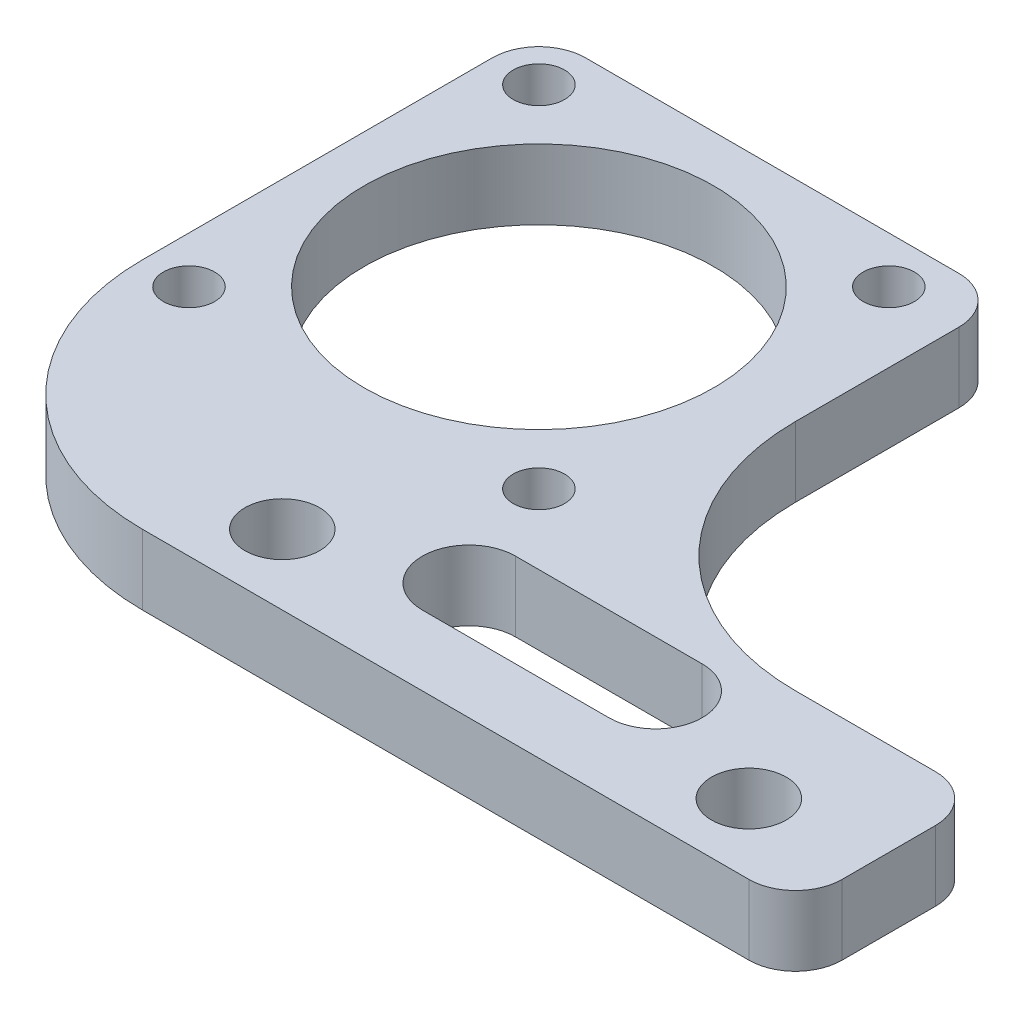
ISO-10303-21;
HEADER;
FILE_DESCRIPTION(('STEP AP214'),'2;1');
FILE_NAME('part.step','',(''),(''),'','','');
FILE_SCHEMA(('AUTOMOTIVE_DESIGN { 1 0 10303 214 1 1 1 1 }'));
ENDSEC;
DATA;
#1=APPLICATION_CONTEXT('core data for automotive mechanical design processes');
#2=APPLICATION_PROTOCOL_DEFINITION('international standard','automotive_design',2000,#1);
#3=PRODUCT_CONTEXT('',#1,'mechanical');
#4=PRODUCT('Part','Part','',(#3));
#5=PRODUCT_RELATED_PRODUCT_CATEGORY('part','',(#4));
#6=PRODUCT_DEFINITION_FORMATION('','',#4);
#7=PRODUCT_DEFINITION_CONTEXT('part definition',#1,'design');
#8=PRODUCT_DEFINITION('design','',#6,#7);
#9=PRODUCT_DEFINITION_SHAPE('','',#8);
#10=(LENGTH_UNIT() NAMED_UNIT(*) SI_UNIT(.MILLI.,.METRE.));
#11=(NAMED_UNIT(*) PLANE_ANGLE_UNIT() SI_UNIT($,.RADIAN.));
#12=(NAMED_UNIT(*) SI_UNIT($,.STERADIAN.) SOLID_ANGLE_UNIT());
#13=UNCERTAINTY_MEASURE_WITH_UNIT(LENGTH_MEASURE(1.E-05),#10,'distance_accuracy_value','');
#14=(GEOMETRIC_REPRESENTATION_CONTEXT(3) GLOBAL_UNCERTAINTY_ASSIGNED_CONTEXT((#13)) GLOBAL_UNIT_ASSIGNED_CONTEXT((#10,
#11,#12)) REPRESENTATION_CONTEXT('',''));
#15=CARTESIAN_POINT('',(0.,0.,0.));
#16=DIRECTION('',(0.,0.,1.));
#17=DIRECTION('',(1.,0.,0.));
#18=AXIS2_PLACEMENT_3D('',#15,#16,#17);
#19=CARTESIAN_POINT('',(0.,3.,0.));
#20=DIRECTION('',(0.,1.,0.));
#21=DIRECTION('',(0.,0.,1.));
#22=AXIS2_PLACEMENT_3D('',#19,#20,#21);
#23=PLANE('',#22);
#24=CARTESIAN_POINT('',(9.5,3.,12.5));
#25=DIRECTION('',(0.,1.,0.));
#26=DIRECTION('',(0.,0.,1.));
#27=AXIS2_PLACEMENT_3D('',#24,#25,#26);
#28=CIRCLE('',#27,2.);
#29=CARTESIAN_POINT('',(9.5,3.,10.5));
#30=VERTEX_POINT('',#29);
#31=CARTESIAN_POINT('',(9.5,3.,14.5));
#32=VERTEX_POINT('',#31);
#33=EDGE_CURVE('E183',#30,#32,#28,.T.);
#34=ORIENTED_EDGE('',*,*,#33,.F.);
#35=DIRECTION('',(-1.,0.,0.));
#36=VECTOR('',#35,1.);
#37=CARTESIAN_POINT('',(9.5,3.,10.5));
#38=LINE('',#37,#36);
#39=CARTESIAN_POINT('',(17.5,3.,10.5));
#40=VERTEX_POINT('',#39);
#41=EDGE_CURVE('E187',#40,#30,#38,.T.);
#42=ORIENTED_EDGE('',*,*,#41,.F.);
#43=CARTESIAN_POINT('',(17.5,3.,12.5));
#44=DIRECTION('',(0.,1.,0.));
#45=DIRECTION('',(0.,0.,1.));
#46=AXIS2_PLACEMENT_3D('',#43,#44,#45);
#47=CIRCLE('',#46,2.);
#48=CARTESIAN_POINT('',(17.5,3.,14.5));
#49=VERTEX_POINT('',#48);
#50=EDGE_CURVE('E165',#49,#40,#47,.T.);
#51=ORIENTED_EDGE('',*,*,#50,.F.);
#52=DIRECTION('',(1.,0.,0.));
#53=VECTOR('',#52,1.);
#54=CARTESIAN_POINT('',(9.5,3.,14.5));
#55=LINE('',#54,#53);
#56=EDGE_CURVE('E177',#32,#49,#55,.T.);
#57=ORIENTED_EDGE('',*,*,#56,.F.);
#58=EDGE_LOOP('',(#34,#42,#51,#57));
#59=FACE_BOUND('',#58,.T.);
#60=CARTESIAN_POINT('',(0.,3.,0.));
#61=DIRECTION('',(0.,1.,0.));
#62=DIRECTION('',(0.,0.,1.));
#63=AXIS2_PLACEMENT_3D('',#60,#61,#62);
#64=CIRCLE('',#63,7.5);
#65=CARTESIAN_POINT('',(0.,3.,7.5));
#66=VERTEX_POINT('',#65);
#67=EDGE_CURVE('E208',#66,#66,#64,.T.);
#68=ORIENTED_EDGE('',*,*,#67,.F.);
#69=EDGE_LOOP('',(#68));
#70=FACE_BOUND('',#69,.T.);
#71=DIRECTION('',(-1.,0.,0.));
#72=VECTOR('',#71,1.);
#73=CARTESIAN_POINT('',(-9.5,3.,-9.5));
#74=LINE('',#73,#72);
#75=CARTESIAN_POINT('',(8.49999999999999,3.,-9.5));
#76=VERTEX_POINT('',#75);
#77=CARTESIAN_POINT('',(-7.5,3.,-9.5));
#78=VERTEX_POINT('',#77);
#79=EDGE_CURVE('E334',#76,#78,#74,.T.);
#80=ORIENTED_EDGE('',*,*,#79,.T.);
#81=CARTESIAN_POINT('',(-7.5,3.,-7.5));
#82=DIRECTION('',(0.,1.,0.));
#83=DIRECTION('',(0.,0.,1.));
#84=AXIS2_PLACEMENT_3D('',#81,#82,#83);
#85=CIRCLE('',#84,2.);
#86=CARTESIAN_POINT('',(-9.5,3.,-7.5));
#87=VERTEX_POINT('',#86);
#88=EDGE_CURVE('E236',#78,#87,#85,.T.);
#89=ORIENTED_EDGE('',*,*,#88,.T.);
#90=DIRECTION('',(0.,0.,1.));
#91=VECTOR('',#90,1.);
#92=CARTESIAN_POINT('',(-9.5,3.,-9.5));
#93=LINE('',#92,#91);
#94=CARTESIAN_POINT('',(-9.5,3.,7.5));
#95=VERTEX_POINT('',#94);
#96=EDGE_CURVE('E248',#87,#95,#93,.T.);
#97=ORIENTED_EDGE('',*,*,#96,.T.);
#98=CARTESIAN_POINT('',(0.500000000000002,3.,7.5));
#99=DIRECTION('',(0.,1.,0.));
#100=DIRECTION('',(0.,0.,1.));
#101=AXIS2_PLACEMENT_3D('',#98,#99,#100);
#102=CIRCLE('',#101,10.);
#103=CARTESIAN_POINT('',(0.500000000000002,3.,17.5));
#104=VERTEX_POINT('',#103);
#105=EDGE_CURVE('E318',#95,#104,#102,.T.);
#106=ORIENTED_EDGE('',*,*,#105,.T.);
#107=DIRECTION('',(1.,0.,0.));
#108=VECTOR('',#107,1.);
#109=CARTESIAN_POINT('',(-9.5,3.,17.5));
#110=LINE('',#109,#108);
#111=CARTESIAN_POINT('',(26.5,3.,17.5));
#112=VERTEX_POINT('',#111);
#113=EDGE_CURVE('E253',#104,#112,#110,.T.);
#114=ORIENTED_EDGE('',*,*,#113,.T.);
#115=CARTESIAN_POINT('',(26.5,3.,15.5));
#116=DIRECTION('',(0.,1.,0.));
#117=DIRECTION('',(0.,0.,1.));
#118=AXIS2_PLACEMENT_3D('',#115,#116,#117);
#119=CIRCLE('',#118,2.);
#120=CARTESIAN_POINT('',(28.5,3.,15.5));
#121=VERTEX_POINT('',#120);
#122=EDGE_CURVE('E265',#112,#121,#119,.T.);
#123=ORIENTED_EDGE('',*,*,#122,.T.);
#124=DIRECTION('',(0.,0.,-1.));
#125=VECTOR('',#124,1.);
#126=CARTESIAN_POINT('',(28.5,3.,-9.5));
#127=LINE('',#126,#125);
#128=CARTESIAN_POINT('',(28.5,3.,11.5));
#129=VERTEX_POINT('',#128);
#130=EDGE_CURVE('E261',#121,#129,#127,.T.);
#131=ORIENTED_EDGE('',*,*,#130,.T.);
#132=CARTESIAN_POINT('',(26.5,3.,11.5));
#133=DIRECTION('',(0.,1.,0.));
#134=DIRECTION('',(0.,0.,1.));
#135=AXIS2_PLACEMENT_3D('',#132,#133,#134);
#136=CIRCLE('',#135,2.);
#137=CARTESIAN_POINT('',(26.5,3.,9.5));
#138=VERTEX_POINT('',#137);
#139=EDGE_CURVE('E69',#129,#138,#136,.T.);
#140=ORIENTED_EDGE('',*,*,#139,.T.);
#141=DIRECTION('',(1.,0.,0.));
#142=VECTOR('',#141,1.);
#143=CARTESIAN_POINT('',(10.5,3.,9.5));
#144=LINE('',#143,#142);
#145=CARTESIAN_POINT('',(20.5,3.,9.5));
#146=VERTEX_POINT('',#145);
#147=EDGE_CURVE('E215',#146,#138,#144,.T.);
#148=ORIENTED_EDGE('',*,*,#147,.F.);
#149=CARTESIAN_POINT('',(20.5,3.,-0.499999999999999));
#150=DIRECTION('',(0.,1.,0.));
#151=DIRECTION('',(0.,0.,1.));
#152=AXIS2_PLACEMENT_3D('',#149,#150,#151);
#153=CIRCLE('',#152,10.);
#154=CARTESIAN_POINT('',(10.5,3.,-0.499999999999997));
#155=VERTEX_POINT('',#154);
#156=EDGE_CURVE('E307',#146,#155,#153,.F.);
#157=ORIENTED_EDGE('',*,*,#156,.T.);
#158=DIRECTION('',(0.,0.,1.));
#159=VECTOR('',#158,1.);
#160=CARTESIAN_POINT('',(10.5,3.,-9.5));
#161=LINE('',#160,#159);
#162=CARTESIAN_POINT('',(10.5,3.,-7.5));
#163=VERTEX_POINT('',#162);
#164=EDGE_CURVE('E216',#163,#155,#161,.T.);
#165=ORIENTED_EDGE('',*,*,#164,.F.);
#166=CARTESIAN_POINT('',(8.49999999999999,3.,-7.5));
#167=DIRECTION('',(0.,1.,0.));
#168=DIRECTION('',(0.,0.,1.));
#169=AXIS2_PLACEMENT_3D('',#166,#167,#168);
#170=CIRCLE('',#169,2.);
#171=EDGE_CURVE('E231',#163,#76,#170,.T.);
#172=ORIENTED_EDGE('',*,*,#171,.T.);
#173=EDGE_LOOP('',(#80,#89,#97,#106,#114,#123,#131,#140,#148,#157,#165,#172));
#174=FACE_BOUND('',#173,.T.);
#175=CARTESIAN_POINT('',(3.5,3.,14.5));
#176=DIRECTION('',(0.,1.,0.));
#177=DIRECTION('',(0.,0.,1.));
#178=AXIS2_PLACEMENT_3D('',#175,#176,#177);
#179=CIRCLE('',#178,1.6);
#180=CARTESIAN_POINT('',(3.5,3.,16.1));
#181=VERTEX_POINT('',#180);
#182=EDGE_CURVE('E401',#181,#181,#179,.T.);
#183=ORIENTED_EDGE('',*,*,#182,.F.);
#184=EDGE_LOOP('',(#183));
#185=FACE_BOUND('',#184,.T.);
#186=CARTESIAN_POINT('',(-7.5,3.,-7.5));
#187=DIRECTION('',(0.,1.,0.));
#188=DIRECTION('',(0.,0.,1.));
#189=AXIS2_PLACEMENT_3D('',#186,#187,#188);
#190=CIRCLE('',#189,1.1);
#191=CARTESIAN_POINT('',(-7.5,3.,-6.4));
#192=VERTEX_POINT('',#191);
#193=EDGE_CURVE('E426',#192,#192,#190,.T.);
#194=ORIENTED_EDGE('',*,*,#193,.F.);
#195=EDGE_LOOP('',(#194));
#196=FACE_BOUND('',#195,.T.);
#197=CARTESIAN_POINT('',(7.5,3.,7.5));
#198=DIRECTION('',(0.,1.,0.));
#199=DIRECTION('',(0.,0.,1.));
#200=AXIS2_PLACEMENT_3D('',#197,#198,#199);
#201=CIRCLE('',#200,1.1);
#202=CARTESIAN_POINT('',(7.5,3.,8.6));
#203=VERTEX_POINT('',#202);
#204=EDGE_CURVE('E354',#203,#203,#201,.T.);
#205=ORIENTED_EDGE('',*,*,#204,.F.);
#206=EDGE_LOOP('',(#205));
#207=FACE_BOUND('',#206,.T.);
#208=CARTESIAN_POINT('',(7.5,3.,-7.5));
#209=DIRECTION('',(0.,1.,0.));
#210=DIRECTION('',(0.,0.,1.));
#211=AXIS2_PLACEMENT_3D('',#208,#209,#210);
#212=CIRCLE('',#211,1.1);
#213=CARTESIAN_POINT('',(7.5,3.,-6.4));
#214=VERTEX_POINT('',#213);
#215=EDGE_CURVE('E434',#214,#214,#212,.T.);
#216=ORIENTED_EDGE('',*,*,#215,.F.);
#217=EDGE_LOOP('',(#216));
#218=FACE_BOUND('',#217,.T.);
#219=CARTESIAN_POINT('',(-7.5,3.,7.5));
#220=DIRECTION('',(0.,1.,0.));
#221=DIRECTION('',(0.,0.,1.));
#222=AXIS2_PLACEMENT_3D('',#219,#220,#221);
#223=CIRCLE('',#222,1.1);
#224=CARTESIAN_POINT('',(-7.5,3.,8.6));
#225=VERTEX_POINT('',#224);
#226=EDGE_CURVE('E421',#225,#225,#223,.T.);
#227=ORIENTED_EDGE('',*,*,#226,.F.);
#228=EDGE_LOOP('',(#227));
#229=FACE_BOUND('',#228,.T.);
#230=CARTESIAN_POINT('',(23.5,3.,14.5));
#231=DIRECTION('',(0.,1.,0.));
#232=DIRECTION('',(0.,0.,1.));
#233=AXIS2_PLACEMENT_3D('',#230,#231,#232);
#234=CIRCLE('',#233,1.6);
#235=CARTESIAN_POINT('',(23.5,3.,16.1));
#236=VERTEX_POINT('',#235);
#237=EDGE_CURVE('E404',#236,#236,#234,.T.);
#238=ORIENTED_EDGE('',*,*,#237,.F.);
#239=EDGE_LOOP('',(#238));
#240=FACE_BOUND('',#239,.T.);
#241=ADVANCED_FACE('F45',(#59,#70,#174,#185,#196,#207,#218,#229,#240),#23,.T.);
#242=CARTESIAN_POINT('',(0.,0.,0.));
#243=DIRECTION('',(0.,1.,0.));
#244=DIRECTION('',(0.,0.,1.));
#245=AXIS2_PLACEMENT_3D('',#242,#243,#244);
#246=PLANE('',#245);
#247=DIRECTION('',(-1.,0.,0.));
#248=VECTOR('',#247,1.);
#249=CARTESIAN_POINT('',(0.,0.,10.5));
#250=LINE('',#249,#248);
#251=CARTESIAN_POINT('',(17.5,0.,10.5));
#252=VERTEX_POINT('',#251);
#253=CARTESIAN_POINT('',(9.5,0.,10.5));
#254=VERTEX_POINT('',#253);
#255=EDGE_CURVE('E296',#252,#254,#250,.T.);
#256=ORIENTED_EDGE('',*,*,#255,.T.);
#257=CARTESIAN_POINT('',(9.5,0.,12.5));
#258=DIRECTION('',(0.,1.,0.));
#259=DIRECTION('',(0.,0.,1.));
#260=AXIS2_PLACEMENT_3D('',#257,#258,#259);
#261=CIRCLE('',#260,2.);
#262=CARTESIAN_POINT('',(9.5,0.,14.5));
#263=VERTEX_POINT('',#262);
#264=EDGE_CURVE('E292',#254,#263,#261,.T.);
#265=ORIENTED_EDGE('',*,*,#264,.T.);
#266=DIRECTION('',(1.,0.,0.));
#267=VECTOR('',#266,1.);
#268=CARTESIAN_POINT('',(0.,0.,14.5));
#269=LINE('',#268,#267);
#270=CARTESIAN_POINT('',(17.5,0.,14.5));
#271=VERTEX_POINT('',#270);
#272=EDGE_CURVE('E301',#263,#271,#269,.T.);
#273=ORIENTED_EDGE('',*,*,#272,.T.);
#274=CARTESIAN_POINT('',(17.5,0.,12.5));
#275=DIRECTION('',(0.,1.,0.));
#276=DIRECTION('',(0.,0.,1.));
#277=AXIS2_PLACEMENT_3D('',#274,#275,#276);
#278=CIRCLE('',#277,2.);
#279=EDGE_CURVE('E168',#271,#252,#278,.T.);
#280=ORIENTED_EDGE('',*,*,#279,.T.);
#281=EDGE_LOOP('',(#256,#265,#273,#280));
#282=FACE_BOUND('',#281,.T.);
#283=CARTESIAN_POINT('',(0.,0.,0.));
#284=DIRECTION('',(0.,1.,0.));
#285=DIRECTION('',(0.,0.,1.));
#286=AXIS2_PLACEMENT_3D('',#283,#284,#285);
#287=CIRCLE('',#286,7.5);
#288=CARTESIAN_POINT('',(0.,0.,7.5));
#289=VERTEX_POINT('',#288);
#290=EDGE_CURVE('E335',#289,#289,#287,.T.);
#291=ORIENTED_EDGE('',*,*,#290,.T.);
#292=EDGE_LOOP('',(#291));
#293=FACE_BOUND('',#292,.T.);
#294=DIRECTION('',(0.,0.,1.));
#295=VECTOR('',#294,1.);
#296=CARTESIAN_POINT('',(-9.5,0.,-9.5));
#297=LINE('',#296,#295);
#298=CARTESIAN_POINT('',(-9.5,0.,-7.5));
#299=VERTEX_POINT('',#298);
#300=CARTESIAN_POINT('',(-9.5,0.,7.5));
#301=VERTEX_POINT('',#300);
#302=EDGE_CURVE('E352',#299,#301,#297,.T.);
#303=ORIENTED_EDGE('',*,*,#302,.F.);
#304=CARTESIAN_POINT('',(-7.5,0.,-7.5));
#305=DIRECTION('',(0.,1.,0.));
#306=DIRECTION('',(0.,0.,1.));
#307=AXIS2_PLACEMENT_3D('',#304,#305,#306);
#308=CIRCLE('',#307,2.);
#309=CARTESIAN_POINT('',(-7.5,0.,-9.5));
#310=VERTEX_POINT('',#309);
#311=EDGE_CURVE('E276',#299,#310,#308,.F.);
#312=ORIENTED_EDGE('',*,*,#311,.T.);
#313=DIRECTION('',(-1.,0.,0.));
#314=VECTOR('',#313,1.);
#315=CARTESIAN_POINT('',(-9.5,0.,-9.5));
#316=LINE('',#315,#314);
#317=CARTESIAN_POINT('',(8.49999999999999,0.,-9.5));
#318=VERTEX_POINT('',#317);
#319=EDGE_CURVE('E254',#318,#310,#316,.T.);
#320=ORIENTED_EDGE('',*,*,#319,.F.);
#321=CARTESIAN_POINT('',(8.49999999999999,0.,-7.5));
#322=DIRECTION('',(0.,1.,0.));
#323=DIRECTION('',(0.,0.,1.));
#324=AXIS2_PLACEMENT_3D('',#321,#322,#323);
#325=CIRCLE('',#324,2.);
#326=CARTESIAN_POINT('',(10.5,0.,-7.5));
#327=VERTEX_POINT('',#326);
#328=EDGE_CURVE('E279',#318,#327,#325,.F.);
#329=ORIENTED_EDGE('',*,*,#328,.T.);
#330=DIRECTION('',(0.,0.,1.));
#331=VECTOR('',#330,1.);
#332=CARTESIAN_POINT('',(10.5,0.,0.));
#333=LINE('',#332,#331);
#334=CARTESIAN_POINT('',(10.5,0.,-0.499999999999998));
#335=VERTEX_POINT('',#334);
#336=EDGE_CURVE('E214',#327,#335,#333,.T.);
#337=ORIENTED_EDGE('',*,*,#336,.T.);
#338=CARTESIAN_POINT('',(20.5,0.,-0.499999999999999));
#339=DIRECTION('',(0.,1.,0.));
#340=DIRECTION('',(0.,0.,1.));
#341=AXIS2_PLACEMENT_3D('',#338,#339,#340);
#342=CIRCLE('',#341,10.);
#343=CARTESIAN_POINT('',(20.5,0.,9.5));
#344=VERTEX_POINT('',#343);
#345=EDGE_CURVE('E304',#335,#344,#342,.T.);
#346=ORIENTED_EDGE('',*,*,#345,.T.);
#347=DIRECTION('',(1.,0.,0.));
#348=VECTOR('',#347,1.);
#349=CARTESIAN_POINT('',(0.,0.,9.5));
#350=LINE('',#349,#348);
#351=CARTESIAN_POINT('',(26.5,0.,9.5));
#352=VERTEX_POINT('',#351);
#353=EDGE_CURVE('E340',#344,#352,#350,.T.);
#354=ORIENTED_EDGE('',*,*,#353,.T.);
#355=CARTESIAN_POINT('',(26.5,0.,11.5));
#356=DIRECTION('',(0.,1.,0.));
#357=DIRECTION('',(0.,0.,1.));
#358=AXIS2_PLACEMENT_3D('',#355,#356,#357);
#359=CIRCLE('',#358,2.);
#360=CARTESIAN_POINT('',(28.5,0.,11.5));
#361=VERTEX_POINT('',#360);
#362=EDGE_CURVE('E282',#352,#361,#359,.F.);
#363=ORIENTED_EDGE('',*,*,#362,.T.);
#364=DIRECTION('',(0.,0.,-1.));
#365=VECTOR('',#364,1.);
#366=CARTESIAN_POINT('',(28.5,0.,-9.5));
#367=LINE('',#366,#365);
#368=CARTESIAN_POINT('',(28.5,0.,15.5));
#369=VERTEX_POINT('',#368);
#370=EDGE_CURVE('E344',#369,#361,#367,.T.);
#371=ORIENTED_EDGE('',*,*,#370,.F.);
#372=CARTESIAN_POINT('',(26.5,0.,15.5));
#373=DIRECTION('',(0.,1.,0.));
#374=DIRECTION('',(0.,0.,1.));
#375=AXIS2_PLACEMENT_3D('',#372,#373,#374);
#376=CIRCLE('',#375,2.);
#377=CARTESIAN_POINT('',(26.5,0.,17.5));
#378=VERTEX_POINT('',#377);
#379=EDGE_CURVE('E285',#369,#378,#376,.F.);
#380=ORIENTED_EDGE('',*,*,#379,.T.);
#381=DIRECTION('',(1.,0.,0.));
#382=VECTOR('',#381,1.);
#383=CARTESIAN_POINT('',(-9.5,0.,17.5));
#384=LINE('',#383,#382);
#385=CARTESIAN_POINT('',(0.500000000000002,0.,17.5));
#386=VERTEX_POINT('',#385);
#387=EDGE_CURVE('E348',#386,#378,#384,.T.);
#388=ORIENTED_EDGE('',*,*,#387,.F.);
#389=CARTESIAN_POINT('',(0.500000000000002,0.,7.5));
#390=DIRECTION('',(0.,1.,0.));
#391=DIRECTION('',(0.,0.,1.));
#392=AXIS2_PLACEMENT_3D('',#389,#390,#391);
#393=CIRCLE('',#392,10.);
#394=EDGE_CURVE('E326',#386,#301,#393,.F.);
#395=ORIENTED_EDGE('',*,*,#394,.T.);
#396=EDGE_LOOP('',(#303,#312,#320,#329,#337,#346,#354,#363,#371,#380,#388,#395));
#397=FACE_BOUND('',#396,.T.);
#398=CARTESIAN_POINT('',(7.5,0.,7.5));
#399=DIRECTION('',(0.,1.,0.));
#400=DIRECTION('',(0.,0.,1.));
#401=AXIS2_PLACEMENT_3D('',#398,#399,#400);
#402=CIRCLE('',#401,1.1);
#403=CARTESIAN_POINT('',(7.5,0.,8.6));
#404=VERTEX_POINT('',#403);
#405=EDGE_CURVE('E255',#404,#404,#402,.T.);
#406=ORIENTED_EDGE('',*,*,#405,.T.);
#407=EDGE_LOOP('',(#406));
#408=FACE_BOUND('',#407,.T.);
#409=CARTESIAN_POINT('',(7.5,0.,-7.5));
#410=DIRECTION('',(0.,1.,0.));
#411=DIRECTION('',(0.,0.,1.));
#412=AXIS2_PLACEMENT_3D('',#409,#410,#411);
#413=CIRCLE('',#412,1.1);
#414=CARTESIAN_POINT('',(7.5,0.,-6.4));
#415=VERTEX_POINT('',#414);
#416=EDGE_CURVE('E437',#415,#415,#413,.T.);
#417=ORIENTED_EDGE('',*,*,#416,.T.);
#418=EDGE_LOOP('',(#417));
#419=FACE_BOUND('',#418,.T.);
#420=CARTESIAN_POINT('',(-7.5,0.,-7.5));
#421=DIRECTION('',(0.,1.,0.));
#422=DIRECTION('',(0.,0.,1.));
#423=AXIS2_PLACEMENT_3D('',#420,#421,#422);
#424=CIRCLE('',#423,1.1);
#425=CARTESIAN_POINT('',(-7.5,0.,-6.4));
#426=VERTEX_POINT('',#425);
#427=EDGE_CURVE('E424',#426,#426,#424,.T.);
#428=ORIENTED_EDGE('',*,*,#427,.T.);
#429=EDGE_LOOP('',(#428));
#430=FACE_BOUND('',#429,.T.);
#431=CARTESIAN_POINT('',(-7.5,0.,7.5));
#432=DIRECTION('',(0.,1.,0.));
#433=DIRECTION('',(0.,0.,1.));
#434=AXIS2_PLACEMENT_3D('',#431,#432,#433);
#435=CIRCLE('',#434,1.1);
#436=CARTESIAN_POINT('',(-7.5,0.,8.6));
#437=VERTEX_POINT('',#436);
#438=EDGE_CURVE('E419',#437,#437,#435,.T.);
#439=ORIENTED_EDGE('',*,*,#438,.T.);
#440=EDGE_LOOP('',(#439));
#441=FACE_BOUND('',#440,.T.);
#442=CARTESIAN_POINT('',(3.5,0.,14.5));
#443=DIRECTION('',(0.,1.,0.));
#444=DIRECTION('',(0.,0.,1.));
#445=AXIS2_PLACEMENT_3D('',#442,#443,#444);
#446=CIRCLE('',#445,1.6);
#447=CARTESIAN_POINT('',(3.5,0.,16.1));
#448=VERTEX_POINT('',#447);
#449=EDGE_CURVE('E407',#448,#448,#446,.T.);
#450=ORIENTED_EDGE('',*,*,#449,.T.);
#451=EDGE_LOOP('',(#450));
#452=FACE_BOUND('',#451,.T.);
#453=CARTESIAN_POINT('',(23.5,0.,14.5));
#454=DIRECTION('',(0.,1.,0.));
#455=DIRECTION('',(0.,0.,1.));
#456=AXIS2_PLACEMENT_3D('',#453,#454,#455);
#457=CIRCLE('',#456,1.6);
#458=CARTESIAN_POINT('',(23.5,0.,16.1));
#459=VERTEX_POINT('',#458);
#460=EDGE_CURVE('E339',#459,#459,#457,.T.);
#461=ORIENTED_EDGE('',*,*,#460,.T.);
#462=EDGE_LOOP('',(#461));
#463=FACE_BOUND('',#462,.T.);
#464=ADVANCED_FACE('F393',(#282,#293,#397,#408,#419,#430,#441,#452,#463),#246,.F.);
#465=CARTESIAN_POINT('',(-9.5,3.,-9.5));
#466=DIRECTION('',(1.,0.,0.));
#467=DIRECTION('',(0.,0.,-1.));
#468=AXIS2_PLACEMENT_3D('',#465,#466,#467);
#469=PLANE('',#468);
#470=ORIENTED_EDGE('',*,*,#96,.F.);
#471=DIRECTION('',(0.,-1.,0.));
#472=VECTOR('',#471,1.);
#473=CARTESIAN_POINT('',(-9.5,3.,-7.5));
#474=LINE('',#473,#472);
#475=EDGE_CURVE('E288',#87,#299,#474,.T.);
#476=ORIENTED_EDGE('',*,*,#475,.T.);
#477=ORIENTED_EDGE('',*,*,#302,.T.);
#478=DIRECTION('',(0.,-1.,0.));
#479=VECTOR('',#478,1.);
#480=CARTESIAN_POINT('',(-9.5,3.,7.5));
#481=LINE('',#480,#479);
#482=EDGE_CURVE('E322',#301,#95,#481,.F.);
#483=ORIENTED_EDGE('',*,*,#482,.T.);
#484=EDGE_LOOP('',(#470,#476,#477,#483));
#485=FACE_BOUND('',#484,.T.);
#486=ADVANCED_FACE('F476',(#485),#469,.F.);
#487=CARTESIAN_POINT('',(-9.5,3.,17.5));
#488=DIRECTION('',(0.,0.,-1.));
#489=DIRECTION('',(-1.,0.,0.));
#490=AXIS2_PLACEMENT_3D('',#487,#488,#489);
#491=PLANE('',#490);
#492=ORIENTED_EDGE('',*,*,#387,.T.);
#493=DIRECTION('',(0.,-1.,0.));
#494=VECTOR('',#493,1.);
#495=CARTESIAN_POINT('',(26.5,3.,17.5));
#496=LINE('',#495,#494);
#497=EDGE_CURVE('E12',#378,#112,#496,.F.);
#498=ORIENTED_EDGE('',*,*,#497,.T.);
#499=ORIENTED_EDGE('',*,*,#113,.F.);
#500=DIRECTION('',(0.,-1.,0.));
#501=VECTOR('',#500,1.);
#502=CARTESIAN_POINT('',(0.500000000000002,3.,17.5));
#503=LINE('',#502,#501);
#504=EDGE_CURVE('E330',#104,#386,#503,.T.);
#505=ORIENTED_EDGE('',*,*,#504,.T.);
#506=EDGE_LOOP('',(#492,#498,#499,#505));
#507=FACE_BOUND('',#506,.T.);
#508=ADVANCED_FACE('F483',(#507),#491,.F.);
#509=CARTESIAN_POINT('',(28.5,3.,-9.5));
#510=DIRECTION('',(-1.,0.,0.));
#511=DIRECTION('',(0.,0.,1.));
#512=AXIS2_PLACEMENT_3D('',#509,#510,#511);
#513=PLANE('',#512);
#514=ORIENTED_EDGE('',*,*,#370,.T.);
#515=DIRECTION('',(0.,1.,0.));
#516=VECTOR('',#515,1.);
#517=CARTESIAN_POINT('',(28.5,3.,11.5));
#518=LINE('',#517,#516);
#519=EDGE_CURVE('E373',#361,#129,#518,.T.);
#520=ORIENTED_EDGE('',*,*,#519,.T.);
#521=ORIENTED_EDGE('',*,*,#130,.F.);
#522=DIRECTION('',(0.,-1.,0.));
#523=VECTOR('',#522,1.);
#524=CARTESIAN_POINT('',(28.5,3.,15.5));
#525=LINE('',#524,#523);
#526=EDGE_CURVE('E370',#121,#369,#525,.T.);
#527=ORIENTED_EDGE('',*,*,#526,.T.);
#528=EDGE_LOOP('',(#514,#520,#521,#527));
#529=FACE_BOUND('',#528,.T.);
#530=ADVANCED_FACE('F369',(#529),#513,.F.);
#531=CARTESIAN_POINT('',(-9.5,3.,-9.5));
#532=DIRECTION('',(0.,0.,1.));
#533=DIRECTION('',(1.,0.,0.));
#534=AXIS2_PLACEMENT_3D('',#531,#532,#533);
#535=PLANE('',#534);
#536=ORIENTED_EDGE('',*,*,#319,.T.);
#537=DIRECTION('',(0.,-1.,0.));
#538=VECTOR('',#537,1.);
#539=CARTESIAN_POINT('',(-7.5,3.,-9.5));
#540=LINE('',#539,#538);
#541=EDGE_CURVE('E269',#310,#78,#540,.F.);
#542=ORIENTED_EDGE('',*,*,#541,.T.);
#543=ORIENTED_EDGE('',*,*,#79,.F.);
#544=DIRECTION('',(0.,-1.,0.));
#545=VECTOR('',#544,1.);
#546=CARTESIAN_POINT('',(8.49999999999999,3.,-9.5));
#547=LINE('',#546,#545);
#548=EDGE_CURVE('E272',#76,#318,#547,.T.);
#549=ORIENTED_EDGE('',*,*,#548,.T.);
#550=EDGE_LOOP('',(#536,#542,#543,#549));
#551=FACE_BOUND('',#550,.T.);
#552=ADVANCED_FACE('F469',(#551),#535,.F.);
#553=CARTESIAN_POINT('',(7.5,3.,7.5));
#554=DIRECTION('',(0.,-1.,0.));
#555=DIRECTION('',(0.,0.,-1.));
#556=AXIS2_PLACEMENT_3D('',#553,#554,#555);
#557=CYLINDRICAL_SURFACE('',#556,1.1);
#558=ORIENTED_EDGE('',*,*,#204,.T.);
#559=EDGE_LOOP('',(#558));
#560=FACE_BOUND('',#559,.T.);
#561=ORIENTED_EDGE('',*,*,#405,.F.);
#562=EDGE_LOOP('',(#561));
#563=FACE_BOUND('',#562,.T.);
#564=ADVANCED_FACE('F505',(#560,#563),#557,.F.);
#565=CARTESIAN_POINT('',(7.5,3.,-7.5));
#566=DIRECTION('',(0.,-1.,0.));
#567=DIRECTION('',(0.,0.,-1.));
#568=AXIS2_PLACEMENT_3D('',#565,#566,#567);
#569=CYLINDRICAL_SURFACE('',#568,1.1);
#570=ORIENTED_EDGE('',*,*,#215,.T.);
#571=EDGE_LOOP('',(#570));
#572=FACE_BOUND('',#571,.T.);
#573=ORIENTED_EDGE('',*,*,#416,.F.);
#574=EDGE_LOOP('',(#573));
#575=FACE_BOUND('',#574,.T.);
#576=ADVANCED_FACE('F532',(#572,#575),#569,.F.);
#577=CARTESIAN_POINT('',(-7.5,3.,-7.5));
#578=DIRECTION('',(0.,-1.,0.));
#579=DIRECTION('',(0.,0.,-1.));
#580=AXIS2_PLACEMENT_3D('',#577,#578,#579);
#581=CYLINDRICAL_SURFACE('',#580,1.1);
#582=ORIENTED_EDGE('',*,*,#193,.T.);
#583=EDGE_LOOP('',(#582));
#584=FACE_BOUND('',#583,.T.);
#585=ORIENTED_EDGE('',*,*,#427,.F.);
#586=EDGE_LOOP('',(#585));
#587=FACE_BOUND('',#586,.T.);
#588=ADVANCED_FACE('F537',(#584,#587),#581,.F.);
#589=CARTESIAN_POINT('',(-7.5,3.,7.5));
#590=DIRECTION('',(0.,-1.,0.));
#591=DIRECTION('',(0.,0.,-1.));
#592=AXIS2_PLACEMENT_3D('',#589,#590,#591);
#593=CYLINDRICAL_SURFACE('',#592,1.1);
#594=ORIENTED_EDGE('',*,*,#226,.T.);
#595=EDGE_LOOP('',(#594));
#596=FACE_BOUND('',#595,.T.);
#597=ORIENTED_EDGE('',*,*,#438,.F.);
#598=EDGE_LOOP('',(#597));
#599=FACE_BOUND('',#598,.T.);
#600=ADVANCED_FACE('F543',(#596,#599),#593,.F.);
#601=CARTESIAN_POINT('',(3.5,3.,14.5));
#602=DIRECTION('',(0.,-1.,0.));
#603=DIRECTION('',(0.,0.,-1.));
#604=AXIS2_PLACEMENT_3D('',#601,#602,#603);
#605=CYLINDRICAL_SURFACE('',#604,1.6);
#606=ORIENTED_EDGE('',*,*,#182,.T.);
#607=EDGE_LOOP('',(#606));
#608=FACE_BOUND('',#607,.T.);
#609=ORIENTED_EDGE('',*,*,#449,.F.);
#610=EDGE_LOOP('',(#609));
#611=FACE_BOUND('',#610,.T.);
#612=ADVANCED_FACE('F550',(#608,#611),#605,.F.);
#613=CARTESIAN_POINT('',(23.5,3.,14.5));
#614=DIRECTION('',(0.,-1.,0.));
#615=DIRECTION('',(0.,0.,-1.));
#616=AXIS2_PLACEMENT_3D('',#613,#614,#615);
#617=CYLINDRICAL_SURFACE('',#616,1.6);
#618=ORIENTED_EDGE('',*,*,#237,.T.);
#619=EDGE_LOOP('',(#618));
#620=FACE_BOUND('',#619,.T.);
#621=ORIENTED_EDGE('',*,*,#460,.F.);
#622=EDGE_LOOP('',(#621));
#623=FACE_BOUND('',#622,.T.);
#624=ADVANCED_FACE('F557',(#620,#623),#617,.F.);
#625=CARTESIAN_POINT('',(10.5,-18.5,9.5));
#626=DIRECTION('',(0.,0.,1.));
#627=DIRECTION('',(1.,0.,0.));
#628=AXIS2_PLACEMENT_3D('',#625,#626,#627);
#629=PLANE('',#628);
#630=ORIENTED_EDGE('',*,*,#147,.T.);
#631=DIRECTION('',(0.,1.,0.));
#632=VECTOR('',#631,1.);
#633=CARTESIAN_POINT('',(26.5,-18.5,9.5));
#634=LINE('',#633,#632);
#635=EDGE_CURVE('E54',#138,#352,#634,.F.);
#636=ORIENTED_EDGE('',*,*,#635,.T.);
#637=ORIENTED_EDGE('',*,*,#353,.F.);
#638=DIRECTION('',(0.,1.,0.));
#639=VECTOR('',#638,1.);
#640=CARTESIAN_POINT('',(20.5,3.,9.5));
#641=LINE('',#640,#639);
#642=EDGE_CURVE('E315',#344,#146,#641,.T.);
#643=ORIENTED_EDGE('',*,*,#642,.T.);
#644=EDGE_LOOP('',(#630,#636,#637,#643));
#645=FACE_BOUND('',#644,.T.);
#646=ADVANCED_FACE('F387',(#645),#629,.F.);
#647=CARTESIAN_POINT('',(10.5,-18.5,-9.5));
#648=DIRECTION('',(-1.,0.,0.));
#649=DIRECTION('',(0.,0.,1.));
#650=AXIS2_PLACEMENT_3D('',#647,#648,#649);
#651=PLANE('',#650);
#652=ORIENTED_EDGE('',*,*,#336,.F.);
#653=DIRECTION('',(0.,-1.,0.));
#654=VECTOR('',#653,1.);
#655=CARTESIAN_POINT('',(10.5,-18.5,-7.5));
#656=LINE('',#655,#654);
#657=EDGE_CURVE('E61',#327,#163,#656,.F.);
#658=ORIENTED_EDGE('',*,*,#657,.T.);
#659=ORIENTED_EDGE('',*,*,#164,.T.);
#660=DIRECTION('',(0.,1.,0.));
#661=VECTOR('',#660,1.);
#662=CARTESIAN_POINT('',(10.5,0.,-0.499999999999998));
#663=LINE('',#662,#661);
#664=EDGE_CURVE('E311',#155,#335,#663,.F.);
#665=ORIENTED_EDGE('',*,*,#664,.T.);
#666=EDGE_LOOP('',(#652,#658,#659,#665));
#667=FACE_BOUND('',#666,.T.);
#668=ADVANCED_FACE('F461',(#667),#651,.F.);
#669=CARTESIAN_POINT('',(0.,-18.5,0.));
#670=DIRECTION('',(0.,1.,0.));
#671=DIRECTION('',(0.,0.,1.));
#672=AXIS2_PLACEMENT_3D('',#669,#670,#671);
#673=CYLINDRICAL_SURFACE('',#672,7.5);
#674=ORIENTED_EDGE('',*,*,#67,.T.);
#675=EDGE_LOOP('',(#674));
#676=FACE_BOUND('',#675,.T.);
#677=ORIENTED_EDGE('',*,*,#290,.F.);
#678=EDGE_LOOP('',(#677));
#679=FACE_BOUND('',#678,.T.);
#680=ADVANCED_FACE('F487',(#676,#679),#673,.F.);
#681=CARTESIAN_POINT('',(0.500000000000002,3.,7.5));
#682=DIRECTION('',(0.,-1.,0.));
#683=DIRECTION('',(0.,0.,-1.));
#684=AXIS2_PLACEMENT_3D('',#681,#682,#683);
#685=CYLINDRICAL_SURFACE('',#684,10.);
#686=ORIENTED_EDGE('',*,*,#105,.F.);
#687=ORIENTED_EDGE('',*,*,#482,.F.);
#688=ORIENTED_EDGE('',*,*,#394,.F.);
#689=ORIENTED_EDGE('',*,*,#504,.F.);
#690=EDGE_LOOP('',(#686,#687,#688,#689));
#691=FACE_BOUND('',#690,.T.);
#692=ADVANCED_FACE('F485',(#691),#685,.T.);
#693=CARTESIAN_POINT('',(20.5,-18.5,-0.499999999999999));
#694=DIRECTION('',(0.,-1.,0.));
#695=DIRECTION('',(0.,0.,-1.));
#696=AXIS2_PLACEMENT_3D('',#693,#694,#695);
#697=CYLINDRICAL_SURFACE('',#696,10.);
#698=ORIENTED_EDGE('',*,*,#345,.F.);
#699=ORIENTED_EDGE('',*,*,#664,.F.);
#700=ORIENTED_EDGE('',*,*,#156,.F.);
#701=ORIENTED_EDGE('',*,*,#642,.F.);
#702=EDGE_LOOP('',(#698,#699,#700,#701));
#703=FACE_BOUND('',#702,.T.);
#704=ADVANCED_FACE('F463',(#703),#697,.F.);
#705=CARTESIAN_POINT('',(9.5,-18.5,12.5));
#706=DIRECTION('',(0.,1.,0.));
#707=DIRECTION('',(0.,0.,1.));
#708=AXIS2_PLACEMENT_3D('',#705,#706,#707);
#709=CYLINDRICAL_SURFACE('',#708,2.);
#710=DIRECTION('',(0.,1.,0.));
#711=VECTOR('',#710,1.);
#712=CARTESIAN_POINT('',(9.5,-18.5,10.5));
#713=LINE('',#712,#711);
#714=EDGE_CURVE('E220',#254,#30,#713,.T.);
#715=ORIENTED_EDGE('',*,*,#714,.T.);
#716=ORIENTED_EDGE('',*,*,#33,.T.);
#717=DIRECTION('',(0.,1.,0.));
#718=VECTOR('',#717,1.);
#719=CARTESIAN_POINT('',(9.5,-18.5,14.5));
#720=LINE('',#719,#718);
#721=EDGE_CURVE('E173',#263,#32,#720,.T.);
#722=ORIENTED_EDGE('',*,*,#721,.F.);
#723=ORIENTED_EDGE('',*,*,#264,.F.);
#724=EDGE_LOOP('',(#715,#716,#722,#723));
#725=FACE_BOUND('',#724,.T.);
#726=ADVANCED_FACE('F410',(#725),#709,.F.);
#727=CARTESIAN_POINT('',(9.5,-18.5,10.5));
#728=DIRECTION('',(0.,0.,-1.));
#729=DIRECTION('',(-1.,0.,0.));
#730=AXIS2_PLACEMENT_3D('',#727,#728,#729);
#731=PLANE('',#730);
#732=DIRECTION('',(0.,1.,0.));
#733=VECTOR('',#732,1.);
#734=CARTESIAN_POINT('',(17.5,-18.5,10.5));
#735=LINE('',#734,#733);
#736=EDGE_CURVE('E172',#252,#40,#735,.T.);
#737=ORIENTED_EDGE('',*,*,#736,.T.);
#738=ORIENTED_EDGE('',*,*,#41,.T.);
#739=ORIENTED_EDGE('',*,*,#714,.F.);
#740=ORIENTED_EDGE('',*,*,#255,.F.);
#741=EDGE_LOOP('',(#737,#738,#739,#740));
#742=FACE_BOUND('',#741,.T.);
#743=ADVANCED_FACE('F414',(#742),#731,.F.);
#744=CARTESIAN_POINT('',(17.5,-18.5,12.5));
#745=DIRECTION('',(0.,1.,0.));
#746=DIRECTION('',(0.,0.,1.));
#747=AXIS2_PLACEMENT_3D('',#744,#745,#746);
#748=CYLINDRICAL_SURFACE('',#747,2.);
#749=DIRECTION('',(0.,1.,0.));
#750=VECTOR('',#749,1.);
#751=CARTESIAN_POINT('',(17.5,-18.5,14.5));
#752=LINE('',#751,#750);
#753=EDGE_CURVE('E160',#271,#49,#752,.T.);
#754=ORIENTED_EDGE('',*,*,#753,.T.);
#755=ORIENTED_EDGE('',*,*,#50,.T.);
#756=ORIENTED_EDGE('',*,*,#736,.F.);
#757=ORIENTED_EDGE('',*,*,#279,.F.);
#758=EDGE_LOOP('',(#754,#755,#756,#757));
#759=FACE_BOUND('',#758,.T.);
#760=ADVANCED_FACE('F162',(#759),#748,.F.);
#761=CARTESIAN_POINT('',(9.5,-18.5,14.5));
#762=DIRECTION('',(0.,0.,1.));
#763=DIRECTION('',(1.,0.,0.));
#764=AXIS2_PLACEMENT_3D('',#761,#762,#763);
#765=PLANE('',#764);
#766=ORIENTED_EDGE('',*,*,#721,.T.);
#767=ORIENTED_EDGE('',*,*,#56,.T.);
#768=ORIENTED_EDGE('',*,*,#753,.F.);
#769=ORIENTED_EDGE('',*,*,#272,.F.);
#770=EDGE_LOOP('',(#766,#767,#768,#769));
#771=FACE_BOUND('',#770,.T.);
#772=ADVANCED_FACE('F178',(#771),#765,.F.);
#773=CARTESIAN_POINT('',(-7.5,3.,-7.5));
#774=DIRECTION('',(0.,-1.,0.));
#775=DIRECTION('',(0.,0.,-1.));
#776=AXIS2_PLACEMENT_3D('',#773,#774,#775);
#777=CYLINDRICAL_SURFACE('',#776,2.);
#778=ORIENTED_EDGE('',*,*,#88,.F.);
#779=ORIENTED_EDGE('',*,*,#541,.F.);
#780=ORIENTED_EDGE('',*,*,#311,.F.);
#781=ORIENTED_EDGE('',*,*,#475,.F.);
#782=EDGE_LOOP('',(#778,#779,#780,#781));
#783=FACE_BOUND('',#782,.T.);
#784=ADVANCED_FACE('F473',(#783),#777,.T.);
#785=CARTESIAN_POINT('',(8.49999999999999,3.,-7.5));
#786=DIRECTION('',(0.,-1.,0.));
#787=DIRECTION('',(0.,0.,-1.));
#788=AXIS2_PLACEMENT_3D('',#785,#786,#787);
#789=CYLINDRICAL_SURFACE('',#788,2.);
#790=ORIENTED_EDGE('',*,*,#171,.F.);
#791=ORIENTED_EDGE('',*,*,#657,.F.);
#792=ORIENTED_EDGE('',*,*,#328,.F.);
#793=ORIENTED_EDGE('',*,*,#548,.F.);
#794=EDGE_LOOP('',(#790,#791,#792,#793));
#795=FACE_BOUND('',#794,.T.);
#796=ADVANCED_FACE('F467',(#795),#789,.T.);
#797=CARTESIAN_POINT('',(26.5,3.,11.5));
#798=DIRECTION('',(0.,1.,0.));
#799=DIRECTION('',(0.,0.,1.));
#800=AXIS2_PLACEMENT_3D('',#797,#798,#799);
#801=CYLINDRICAL_SURFACE('',#800,2.);
#802=ORIENTED_EDGE('',*,*,#362,.F.);
#803=ORIENTED_EDGE('',*,*,#635,.F.);
#804=ORIENTED_EDGE('',*,*,#139,.F.);
#805=ORIENTED_EDGE('',*,*,#519,.F.);
#806=EDGE_LOOP('',(#802,#803,#804,#805));
#807=FACE_BOUND('',#806,.T.);
#808=ADVANCED_FACE('F398',(#807),#801,.T.);
#809=CARTESIAN_POINT('',(26.5,3.,15.5));
#810=DIRECTION('',(0.,-1.,0.));
#811=DIRECTION('',(0.,0.,-1.));
#812=AXIS2_PLACEMENT_3D('',#809,#810,#811);
#813=CYLINDRICAL_SURFACE('',#812,2.);
#814=ORIENTED_EDGE('',*,*,#122,.F.);
#815=ORIENTED_EDGE('',*,*,#497,.F.);
#816=ORIENTED_EDGE('',*,*,#379,.F.);
#817=ORIENTED_EDGE('',*,*,#526,.F.);
#818=EDGE_LOOP('',(#814,#815,#816,#817));
#819=FACE_BOUND('',#818,.T.);
#820=ADVANCED_FACE('F47',(#819),#813,.T.);
#821=CLOSED_SHELL('',(#241,#464,#486,#508,#530,#552,#564,#576,#588,#600,#612,#624,#646,#668,
#680,#692,#704,#726,#743,#760,#772,#784,#796,#808,#820));
#822=MANIFOLD_SOLID_BREP('B2',#821);
#823=ADVANCED_BREP_SHAPE_REPRESENTATION('',(#18,#822),#14);
#824=SHAPE_DEFINITION_REPRESENTATION(#9,#823);
ENDSEC;
END-ISO-10303-21;
